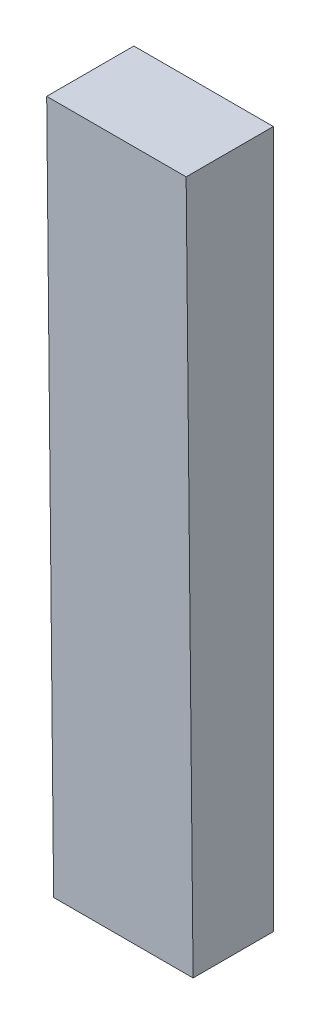
ISO-10303-21;
HEADER;
FILE_DESCRIPTION(('STEP AP214'),'2;1');
FILE_NAME('part.step','',(''),(''),'','','');
FILE_SCHEMA(('AUTOMOTIVE_DESIGN { 1 0 10303 214 1 1 1 1 }'));
ENDSEC;
DATA;
#1=APPLICATION_CONTEXT('core data for automotive mechanical design processes');
#2=APPLICATION_PROTOCOL_DEFINITION('international standard','automotive_design',2000,#1);
#3=PRODUCT_CONTEXT('',#1,'mechanical');
#4=PRODUCT('Part','Part','',(#3));
#5=PRODUCT_RELATED_PRODUCT_CATEGORY('part','',(#4));
#6=PRODUCT_DEFINITION_FORMATION('','',#4);
#7=PRODUCT_DEFINITION_CONTEXT('part definition',#1,'design');
#8=PRODUCT_DEFINITION('design','',#6,#7);
#9=PRODUCT_DEFINITION_SHAPE('','',#8);
#10=(LENGTH_UNIT() NAMED_UNIT(*) SI_UNIT(.MILLI.,.METRE.));
#11=(NAMED_UNIT(*) PLANE_ANGLE_UNIT() SI_UNIT($,.RADIAN.));
#12=(NAMED_UNIT(*) SI_UNIT($,.STERADIAN.) SOLID_ANGLE_UNIT());
#13=UNCERTAINTY_MEASURE_WITH_UNIT(LENGTH_MEASURE(1.E-05),#10,'distance_accuracy_value','');
#14=(GEOMETRIC_REPRESENTATION_CONTEXT(3) GLOBAL_UNCERTAINTY_ASSIGNED_CONTEXT((#13)) GLOBAL_UNIT_ASSIGNED_CONTEXT((#10,
#11,#12)) REPRESENTATION_CONTEXT('',''));
#15=CARTESIAN_POINT('',(0.,0.,0.));
#16=DIRECTION('',(0.,0.,1.));
#17=DIRECTION('',(1.,0.,0.));
#18=AXIS2_PLACEMENT_3D('',#15,#16,#17);
#19=CARTESIAN_POINT('',(32.,0.,20.));
#20=DIRECTION('',(0.,-1.,0.));
#21=DIRECTION('',(0.,0.,-1.));
#22=AXIS2_PLACEMENT_3D('',#19,#20,#21);
#23=PLANE('',#22);
#24=DIRECTION('',(0.,0.,1.));
#25=VECTOR('',#24,1.);
#26=CARTESIAN_POINT('',(0.,0.,20.));
#27=LINE('',#26,#25);
#28=CARTESIAN_POINT('',(0.,0.,0.));
#29=VERTEX_POINT('',#28);
#30=CARTESIAN_POINT('',(0.,0.,20.));
#31=VERTEX_POINT('',#30);
#32=EDGE_CURVE('E113',#29,#31,#27,.T.);
#33=ORIENTED_EDGE('',*,*,#32,.T.);
#34=DIRECTION('',(-1.,0.,0.));
#35=VECTOR('',#34,1.);
#36=CARTESIAN_POINT('',(32.,0.,20.));
#37=LINE('',#36,#35);
#38=CARTESIAN_POINT('',(32.,0.,20.));
#39=VERTEX_POINT('',#38);
#40=EDGE_CURVE('E11',#39,#31,#37,.T.);
#41=ORIENTED_EDGE('',*,*,#40,.F.);
#42=DIRECTION('',(0.,0.,1.));
#43=VECTOR('',#42,1.);
#44=CARTESIAN_POINT('',(32.,0.,20.));
#45=LINE('',#44,#43);
#46=CARTESIAN_POINT('',(32.,0.,0.));
#47=VERTEX_POINT('',#46);
#48=EDGE_CURVE('E97',#47,#39,#45,.T.);
#49=ORIENTED_EDGE('',*,*,#48,.F.);
#50=DIRECTION('',(-1.,0.,0.));
#51=VECTOR('',#50,1.);
#52=CARTESIAN_POINT('',(32.,0.,0.));
#53=LINE('',#52,#51);
#54=EDGE_CURVE('E109',#47,#29,#53,.T.);
#55=ORIENTED_EDGE('',*,*,#54,.T.);
#56=EDGE_LOOP('',(#33,#41,#49,#55));
#57=FACE_BOUND('',#56,.T.);
#58=ADVANCED_FACE('F45',(#57),#23,.F.);
#59=CARTESIAN_POINT('',(32.,-160.,18.4082072084857));
#60=DIRECTION('',(0.,0.00994821263836736,-0.999950515308284));
#61=DIRECTION('',(0.,0.999950515308284,0.00994821263836736));
#62=AXIS2_PLACEMENT_3D('',#59,#60,#61);
#63=PLANE('',#62);
#64=DIRECTION('',(0.,-0.999950515308283,-0.00994821263836736));
#65=VECTOR('',#64,1.);
#66=CARTESIAN_POINT('',(0.,-160.,18.4082072084857));
#67=LINE('',#66,#65);
#68=CARTESIAN_POINT('',(0.,-160.,18.4082072084857));
#69=VERTEX_POINT('',#68);
#70=EDGE_CURVE('E102',#31,#69,#67,.T.);
#71=ORIENTED_EDGE('',*,*,#70,.T.);
#72=DIRECTION('',(-1.,0.,0.));
#73=VECTOR('',#72,1.);
#74=CARTESIAN_POINT('',(32.,-160.,18.4082072084857));
#75=LINE('',#74,#73);
#76=CARTESIAN_POINT('',(32.,-160.,18.4082072084857));
#77=VERTEX_POINT('',#76);
#78=EDGE_CURVE('E54',#77,#69,#75,.T.);
#79=ORIENTED_EDGE('',*,*,#78,.F.);
#80=DIRECTION('',(0.,-0.999950515308283,-0.00994821263836736));
#81=VECTOR('',#80,1.);
#82=CARTESIAN_POINT('',(32.,-160.,18.4082072084857));
#83=LINE('',#82,#81);
#84=EDGE_CURVE('E92',#39,#77,#83,.T.);
#85=ORIENTED_EDGE('',*,*,#84,.F.);
#86=ORIENTED_EDGE('',*,*,#40,.T.);
#87=EDGE_LOOP('',(#71,#79,#85,#86));
#88=FACE_BOUND('',#87,.T.);
#89=ADVANCED_FACE('F101',(#88),#63,.F.);
#90=CARTESIAN_POINT('',(32.,-160.,0.));
#91=DIRECTION('',(0.,1.,0.));
#92=DIRECTION('',(0.,0.,1.));
#93=AXIS2_PLACEMENT_3D('',#90,#91,#92);
#94=PLANE('',#93);
#95=DIRECTION('',(0.,0.,-1.));
#96=VECTOR('',#95,1.);
#97=CARTESIAN_POINT('',(0.,-160.,0.));
#98=LINE('',#97,#96);
#99=CARTESIAN_POINT('',(0.,-160.,0.));
#100=VERTEX_POINT('',#99);
#101=EDGE_CURVE('E79',#69,#100,#98,.T.);
#102=ORIENTED_EDGE('',*,*,#101,.T.);
#103=DIRECTION('',(-1.,0.,0.));
#104=VECTOR('',#103,1.);
#105=CARTESIAN_POINT('',(32.,-160.,0.));
#106=LINE('',#105,#104);
#107=CARTESIAN_POINT('',(32.,-160.,0.));
#108=VERTEX_POINT('',#107);
#109=EDGE_CURVE('E104',#108,#100,#106,.T.);
#110=ORIENTED_EDGE('',*,*,#109,.F.);
#111=DIRECTION('',(0.,0.,-1.));
#112=VECTOR('',#111,1.);
#113=CARTESIAN_POINT('',(32.,-160.,0.));
#114=LINE('',#113,#112);
#115=EDGE_CURVE('E95',#77,#108,#114,.T.);
#116=ORIENTED_EDGE('',*,*,#115,.F.);
#117=ORIENTED_EDGE('',*,*,#78,.T.);
#118=EDGE_LOOP('',(#102,#110,#116,#117));
#119=FACE_BOUND('',#118,.T.);
#120=ADVANCED_FACE('F105',(#119),#94,.F.);
#121=CARTESIAN_POINT('',(32.,0.,0.));
#122=DIRECTION('',(0.,0.,1.));
#123=DIRECTION('',(1.,0.,0.));
#124=AXIS2_PLACEMENT_3D('',#121,#122,#123);
#125=PLANE('',#124);
#126=DIRECTION('',(0.,1.,0.));
#127=VECTOR('',#126,1.);
#128=CARTESIAN_POINT('',(0.,0.,0.));
#129=LINE('',#128,#127);
#130=EDGE_CURVE('E85',#100,#29,#129,.T.);
#131=ORIENTED_EDGE('',*,*,#130,.T.);
#132=ORIENTED_EDGE('',*,*,#54,.F.);
#133=DIRECTION('',(0.,1.,0.));
#134=VECTOR('',#133,1.);
#135=CARTESIAN_POINT('',(32.,0.,0.));
#136=LINE('',#135,#134);
#137=EDGE_CURVE('E62',#108,#47,#136,.T.);
#138=ORIENTED_EDGE('',*,*,#137,.F.);
#139=ORIENTED_EDGE('',*,*,#109,.T.);
#140=EDGE_LOOP('',(#131,#132,#138,#139));
#141=FACE_BOUND('',#140,.T.);
#142=ADVANCED_FACE('F126',(#141),#125,.F.);
#143=CARTESIAN_POINT('',(32.,0.,0.));
#144=DIRECTION('',(-1.,0.,0.));
#145=DIRECTION('',(0.,0.,1.));
#146=AXIS2_PLACEMENT_3D('',#143,#144,#145);
#147=PLANE('',#146);
#148=ORIENTED_EDGE('',*,*,#48,.T.);
#149=ORIENTED_EDGE('',*,*,#84,.T.);
#150=ORIENTED_EDGE('',*,*,#115,.T.);
#151=ORIENTED_EDGE('',*,*,#137,.T.);
#152=EDGE_LOOP('',(#148,#149,#150,#151));
#153=FACE_BOUND('',#152,.T.);
#154=ADVANCED_FACE('F93',(#153),#147,.F.);
#155=CARTESIAN_POINT('',(0.,0.,0.));
#156=DIRECTION('',(-1.,0.,0.));
#157=DIRECTION('',(0.,0.,1.));
#158=AXIS2_PLACEMENT_3D('',#155,#156,#157);
#159=PLANE('',#158);
#160=ORIENTED_EDGE('',*,*,#32,.F.);
#161=ORIENTED_EDGE('',*,*,#130,.F.);
#162=ORIENTED_EDGE('',*,*,#101,.F.);
#163=ORIENTED_EDGE('',*,*,#70,.F.);
#164=EDGE_LOOP('',(#160,#161,#162,#163));
#165=FACE_BOUND('',#164,.T.);
#166=ADVANCED_FACE('F129',(#165),#159,.T.);
#167=CLOSED_SHELL('',(#58,#89,#120,#142,#154,#166));
#168=MANIFOLD_SOLID_BREP('B2',#167);
#169=ADVANCED_BREP_SHAPE_REPRESENTATION('',(#18,#168),#14);
#170=SHAPE_DEFINITION_REPRESENTATION(#9,#169);
ENDSEC;
END-ISO-10303-21;
